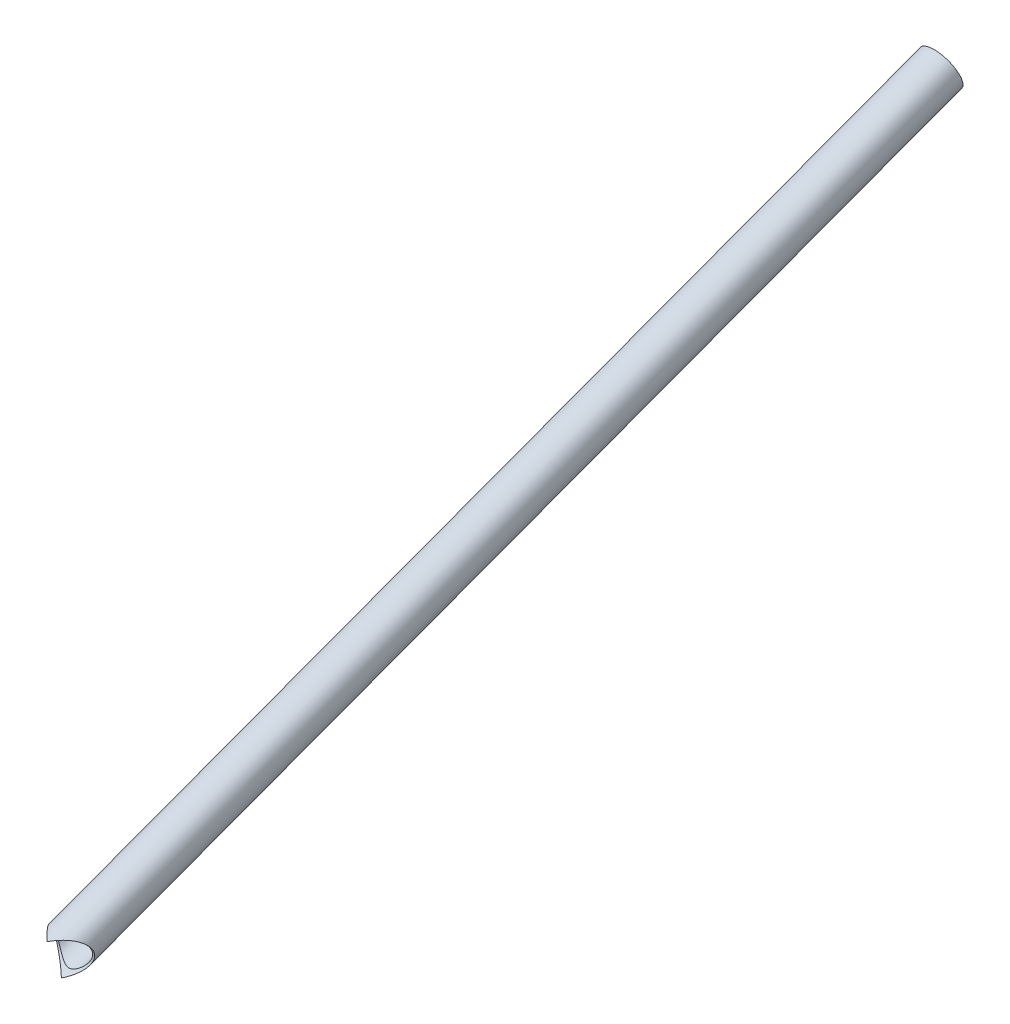
ISO-10303-21;
HEADER;
FILE_DESCRIPTION(('STEP AP214'),'2;1');
FILE_NAME('part.step','',(''),(''),'','','');
FILE_SCHEMA(('AUTOMOTIVE_DESIGN { 1 0 10303 214 1 1 1 1 }'));
ENDSEC;
DATA;
#1=APPLICATION_CONTEXT('core data for automotive mechanical design processes');
#2=APPLICATION_PROTOCOL_DEFINITION('international standard','automotive_design',2000,#1);
#3=PRODUCT_CONTEXT('',#1,'mechanical');
#4=PRODUCT('Part','Part','',(#3));
#5=PRODUCT_RELATED_PRODUCT_CATEGORY('part','',(#4));
#6=PRODUCT_DEFINITION_FORMATION('','',#4);
#7=PRODUCT_DEFINITION_CONTEXT('part definition',#1,'design');
#8=PRODUCT_DEFINITION('design','',#6,#7);
#9=PRODUCT_DEFINITION_SHAPE('','',#8);
#10=(LENGTH_UNIT() NAMED_UNIT(*) SI_UNIT(.MILLI.,.METRE.));
#11=(NAMED_UNIT(*) PLANE_ANGLE_UNIT() SI_UNIT($,.RADIAN.));
#12=(NAMED_UNIT(*) SI_UNIT($,.STERADIAN.) SOLID_ANGLE_UNIT());
#13=UNCERTAINTY_MEASURE_WITH_UNIT(LENGTH_MEASURE(1.E-05),#10,'distance_accuracy_value','');
#14=(GEOMETRIC_REPRESENTATION_CONTEXT(3) GLOBAL_UNCERTAINTY_ASSIGNED_CONTEXT((#13)) GLOBAL_UNIT_ASSIGNED_CONTEXT((#10,
#11,#12)) REPRESENTATION_CONTEXT('',''));
#15=CARTESIAN_POINT('',(0.,0.,0.));
#16=DIRECTION('',(0.,0.,1.));
#17=DIRECTION('',(1.,0.,0.));
#18=AXIS2_PLACEMENT_3D('',#15,#16,#17);
#19=CARTESIAN_POINT('',(0.,380.,-601.037933611912));
#20=DIRECTION('',(0.,0.347902326560255,-0.937530784120693));
#21=DIRECTION('',(0.,0.937530784120693,0.347902326560255));
#22=AXIS2_PLACEMENT_3D('',#19,#20,#21);
#23=CYLINDRICAL_SURFACE('',#22,11.3);
#24=CARTESIAN_POINT('',(0.,580.,-1140.));
#25=DIRECTION('',(0.,-0.347902326560255,0.937530784120693));
#26=DIRECTION('',(1.,0.,0.));
#27=AXIS2_PLACEMENT_3D('',#24,#25,#26);
#28=CIRCLE('',#27,11.3);
#29=CARTESIAN_POINT('',(11.3,580.,-1140.));
#30=VERTEX_POINT('',#29);
#31=EDGE_CURVE('E80',#30,#30,#28,.T.);
#32=ORIENTED_EDGE('',*,*,#31,.F.);
#33=EDGE_LOOP('',(#32));
#34=FACE_BOUND('',#33,.T.);
#35=CARTESIAN_POINT('',(0.,392.453342057347,-602.116947792873));
#36=CARTESIAN_POINT('',(-0.167247256523669,392.453342441627,-602.116952430379));
#37=CARTESIAN_POINT('',(-0.334517045693208,392.452597389198,-602.125650423935));
#38=CARTESIAN_POINT('',(-0.667369726955175,392.449556950798,-602.159902118997));
#39=CARTESIAN_POINT('',(-0.832951503456848,392.447260599479,-602.185466315847));
#40=CARTESIAN_POINT('',(-1.1614240790713,392.440941017438,-602.252057150859));
#41=CARTESIAN_POINT('',(-1.32430515357925,392.436912551836,-602.293130615677));
#42=CARTESIAN_POINT('',(-1.64603700319463,392.426892583405,-602.388728590837));
#43=CARTESIAN_POINT('',(-1.80488562586285,392.420900054992,-602.443260124969));
#44=CARTESIAN_POINT('',(-2.19446472620365,392.403220829904,-602.592990348526));
#45=CARTESIAN_POINT('',(-2.42248985758328,392.39018238157,-602.695055061053));
#46=CARTESIAN_POINT('',(-2.86869490176922,392.358315954157,-602.918018719347));
#47=CARTESIAN_POINT('',(-3.08686783951836,392.33948394488,-603.03893074697));
#48=CARTESIAN_POINT('',(-3.51477110345759,392.295191739672,-603.295193643021));
#49=CARTESIAN_POINT('',(-3.72447125377136,392.269709915723,-603.430590759169));
#50=CARTESIAN_POINT('',(-4.13549566719057,392.211485227177,-603.71194049216));
#51=CARTESIAN_POINT('',(-4.3368211139367,392.178743392844,-603.857891609311));
#52=CARTESIAN_POINT('',(-4.87692251430436,392.078475943431,-604.267764639645));
#53=CARTESIAN_POINT('',(-5.20819819231981,392.003052483123,-604.539691568161));
#54=CARTESIAN_POINT('',(-5.85078021100629,391.825781594503,-605.098362301212));
#55=CARTESIAN_POINT('',(-6.16207348921072,391.72391709677,-605.385115581008));
#56=CARTESIAN_POINT('',(-6.76486465930636,391.491440583005,-605.966912911055));
#57=CARTESIAN_POINT('',(-7.05638581661156,391.360863148603,-606.26194661868));
#58=CARTESIAN_POINT('',(-7.61920050725674,391.068571307631,-606.855680880781));
#59=CARTESIAN_POINT('',(-7.89050422320894,390.906872724431,-607.1543794999));
#60=CARTESIAN_POINT('',(-8.34731535676116,390.593761937343,-607.678051656785));
#61=CARTESIAN_POINT('',(-8.53757257777572,390.449513983037,-607.903181140762));
#62=CARTESIAN_POINT('',(-8.90424841032178,390.141071324446,-608.351113241831));
#63=CARTESIAN_POINT('',(-9.0806672368974,389.976876930223,-608.573915895036));
#64=CARTESIAN_POINT('',(-9.41781791022503,389.628060235374,-609.014734408191));
#65=CARTESIAN_POINT('',(-9.57857127359037,389.443466719029,-609.232756505723));
#66=CARTESIAN_POINT('',(-9.88273763612191,389.053202598082,-609.661946117587));
#67=CARTESIAN_POINT('',(-10.0261543955268,388.847536581964,-609.873115111036));
#68=CARTESIAN_POINT('',(-10.2671190114125,388.457726956456,-610.245238619388));
#69=CARTESIAN_POINT('',(-10.3681353034134,388.277335609576,-610.407884314735));
#70=CARTESIAN_POINT('',(-10.5563964070072,387.903175405704,-610.725555243905));
#71=CARTESIAN_POINT('',(-10.6436441819675,387.709409440241,-610.880582112552));
#72=CARTESIAN_POINT('',(-10.8031526496522,387.309059816766,-611.181419834839));
#73=CARTESIAN_POINT('',(-10.8754182916593,387.102480421007,-611.327233720845));
#74=CARTESIAN_POINT('',(-11.0038556543809,386.677312093936,-611.608099417645));
#75=CARTESIAN_POINT('',(-11.0600272004119,386.458723032304,-611.743151111617));
#76=CARTESIAN_POINT('',(-11.1555760567688,386.009389634075,-612.001730141394));
#77=CARTESIAN_POINT('',(-11.1948464280512,385.778577983701,-612.125180339967));
#78=CARTESIAN_POINT('',(-11.2553134552739,385.307718001965,-612.358141922711));
#79=CARTESIAN_POINT('',(-11.2765100657316,385.067669647361,-612.467653271805));
#80=CARTESIAN_POINT('',(-11.3003889325305,384.580389271138,-612.671495572959));
#81=CARTESIAN_POINT('',(-11.3030762859756,384.333159246052,-612.765830697279));
#82=CARTESIAN_POINT('',(-11.2898915969375,383.833664202421,-612.938472673762));
#83=CARTESIAN_POINT('',(-11.2740208675926,383.581399541359,-613.016780659517));
#84=CARTESIAN_POINT('',(-11.2265476182198,383.099392133039,-613.149908504596));
#85=CARTESIAN_POINT('',(-11.1966680163529,382.869906643212,-613.206290365006));
#86=CARTESIAN_POINT('',(-11.1226096819991,382.410260806115,-613.30561237424));
#87=CARTESIAN_POINT('',(-11.0784262356464,382.180100261192,-613.348548082663));
#88=CARTESIAN_POINT('',(-10.9764379778501,381.720751534017,-613.421110977959));
#89=CARTESIAN_POINT('',(-10.9186349086599,381.491563231209,-613.450739865663));
#90=CARTESIAN_POINT('',(-10.7901995529481,381.035480600346,-613.497080427393));
#91=CARTESIAN_POINT('',(-10.7195656521075,380.808586564742,-613.513790474635));
#92=CARTESIAN_POINT('',(-10.5623040366913,380.346434627591,-613.535383806888));
#93=CARTESIAN_POINT('',(-10.4750299432342,380.111365511493,-613.539597928109));
#94=CARTESIAN_POINT('',(-10.2883086228122,379.646310341169,-613.535094848314));
#95=CARTESIAN_POINT('',(-10.1888612488371,379.416324348367,-613.526377491118));
#96=CARTESIAN_POINT('',(-9.87373031565818,378.735286212779,-613.48209687685));
#97=CARTESIAN_POINT('',(-9.6412011545506,378.292989745149,-613.42841155254));
#98=CARTESIAN_POINT('',(-9.19848605201082,377.539062661362,-613.297781004797));
#99=CARTESIAN_POINT('',(-8.99600308024673,377.22125142674,-613.229329083034));
#100=CARTESIAN_POINT('',(-8.5719161587861,376.60391451748,-613.071967432378));
#101=CARTESIAN_POINT('',(-8.35031015416288,376.304390813907,-612.983055503174));
#102=CARTESIAN_POINT('',(-7.88922724120237,375.723699486472,-612.787719554018));
#103=CARTESIAN_POINT('',(-7.64968845980409,375.44260234321,-612.681233217905));
#104=CARTESIAN_POINT('',(-7.1548485146099,374.900804217675,-612.454343526597));
#105=CARTESIAN_POINT('',(-6.89955076540495,374.640098844555,-612.333943181338));
#106=CARTESIAN_POINT('',(-6.3673538008942,374.133815903112,-612.079673571762));
#107=CARTESIAN_POINT('',(-6.09007999538986,373.888761172595,-611.945547755311));
#108=CARTESIAN_POINT('',(-5.51917817242472,373.42217213273,-611.670690552847));
#109=CARTESIAN_POINT('',(-5.22554050591782,373.200651929237,-611.529955277387));
#110=CARTESIAN_POINT('',(-4.621679248474,372.784265487489,-611.248024459058));
#111=CARTESIAN_POINT('',(-4.3115180394719,372.589307686313,-611.106832308239));
#112=CARTESIAN_POINT('',(-3.83147780727146,372.319478088897,-610.900615135355));
#113=CARTESIAN_POINT('',(-3.66907620410565,372.233337223072,-610.832834528273));
#114=CARTESIAN_POINT('',(-3.33886130303319,372.069364809118,-610.700546322484));
#115=CARTESIAN_POINT('',(-3.17104958934559,371.991530856776,-610.636037779617));
#116=CARTESIAN_POINT('',(-2.85592807372785,371.856504980963,-610.521607880396));
#117=CARTESIAN_POINT('',(-2.70945473997353,371.797981595928,-610.470972350023));
#118=CARTESIAN_POINT('',(-2.41221080368844,371.688443488657,-610.374600346321));
#119=CARTESIAN_POINT('',(-2.26144032993178,371.637428541694,-610.32886372638));
#120=CARTESIAN_POINT('',(-1.80303053207386,371.497321774175,-610.201470122546));
#121=CARTESIAN_POINT('',(-1.48838666465815,371.420766829981,-610.129280950874));
#122=CARTESIAN_POINT('',(-1.02994230769028,371.342083552138,-610.054115343319));
#123=CARTESIAN_POINT('',(-0.891577853868114,371.32244556345,-610.035183417919));
#124=CARTESIAN_POINT('',(-0.613092024492928,371.29152552686,-610.00526002626));
#125=CARTESIAN_POINT('',(-0.472971578621382,371.280239232801,-609.994264525045));
#126=CARTESIAN_POINT('',(-0.191947405409433,371.266414211031,-609.980784076392));
#127=CARTESIAN_POINT('',(-0.0510440294322969,371.263871833961,-609.978295578475));
#128=CARTESIAN_POINT('',(0.230536171264379,371.267613396428,-609.98195007398));
#129=CARTESIAN_POINT('',(0.37121298810752,371.273897636466,-609.98809336127));
#130=CARTESIAN_POINT('',(0.650770198517014,371.295029545562,-610.008647179639));
#131=CARTESIAN_POINT('',(0.789655339860527,371.309845135506,-610.023026740065));
#132=CARTESIAN_POINT('',(1.06535436538545,371.347529490727,-610.05932112728));
#133=CARTESIAN_POINT('',(1.20216734949686,371.370401656458,-610.081239135743));
#134=CARTESIAN_POINT('',(1.60883972076339,371.45021706687,-610.156957476377));
#135=CARTESIAN_POINT('',(1.87470746913738,371.518340507326,-610.220702960518));
#136=CARTESIAN_POINT('',(2.37489852856182,371.673024068535,-610.361105057329));
#137=CARTESIAN_POINT('',(2.6101198375835,371.757925413914,-610.436518668541));
#138=CARTESIAN_POINT('',(3.0701702343698,371.945039223702,-610.597371617636));
#139=CARTESIAN_POINT('',(3.29498994421838,372.047266936507,-610.682819766082));
#140=CARTESIAN_POINT('',(3.73583456013439,372.26681716697,-610.859738055731));
#141=CARTESIAN_POINT('',(3.95182061427099,372.384198530073,-610.951230955821));
#142=CARTESIAN_POINT('',(4.37498141155462,372.631916056795,-611.136712070262));
#143=CARTESIAN_POINT('',(4.58215790526032,372.762249629325,-611.230699782779));
#144=CARTESIAN_POINT('',(5.12498523902664,373.126106470521,-611.481874845541));
#145=CARTESIAN_POINT('',(5.45355996844679,373.370187046896,-611.639150749578));
#146=CARTESIAN_POINT('',(6.0907682864414,373.887841280775,-611.945834499136));
#147=CARTESIAN_POINT('',(6.39938966229744,374.161432732539,-612.095237515796));
#148=CARTESIAN_POINT('',(6.99636022916789,374.735701123718,-612.3798788822));
#149=CARTESIAN_POINT('',(7.28474106953569,375.036334020264,-612.515139515726));
#150=CARTESIAN_POINT('',(7.84057125870951,375.663650466025,-612.766539727347));
#151=CARTESIAN_POINT('',(8.10803162666014,375.990320115687,-612.88268940755));
#152=CARTESIAN_POINT('',(8.55093243721588,376.57723878334,-613.062989324813));
#153=CARTESIAN_POINT('',(8.7317726970127,376.831717139535,-613.132722736806));
#154=CARTESIAN_POINT('',(9.07978253764383,377.353299250243,-613.257460550337));
#155=CARTESIAN_POINT('',(9.24695530987228,377.620400034267,-613.312468397195));
#156=CARTESIAN_POINT('',(9.56588969966902,378.166067433569,-613.405763642053));
#157=CARTESIAN_POINT('',(9.71766940528557,378.444620037947,-613.444070843478));
#158=CARTESIAN_POINT('',(10.0041765885252,379.01225061031,-613.502109870907));
#159=CARTESIAN_POINT('',(10.1389074068349,379.301326501944,-613.521845340889));
#160=CARTESIAN_POINT('',(10.3659931437835,379.833743992926,-613.539114756362));
#161=CARTESIAN_POINT('',(10.4615703100336,380.07560312263,-613.540092571396));
#162=CARTESIAN_POINT('',(10.6388867699247,380.563957164864,-613.527592566518));
#163=CARTESIAN_POINT('',(10.7206290893942,380.810451050587,-613.514117912258));
#164=CARTESIAN_POINT('',(10.8691128866135,381.306570405169,-613.471952445436));
#165=CARTESIAN_POINT('',(10.9358593956667,381.556194793934,-613.443266747278));
#166=CARTESIAN_POINT('',(11.0533164204513,382.056931908409,-613.370128959255));
#167=CARTESIAN_POINT('',(11.1040267716979,382.308044649358,-613.325676707679));
#168=CARTESIAN_POINT('',(11.1887460317201,382.811212485983,-613.220442014158));
#169=CARTESIAN_POINT('',(11.222658747834,383.063264866662,-613.159568532612));
#170=CARTESIAN_POINT('',(11.2726913157075,383.564723377991,-613.021687545756));
#171=CARTESIAN_POINT('',(11.288811121826,383.814129501851,-612.94467999906));
#172=CARTESIAN_POINT('',(11.3029289316654,384.308030067659,-612.775013563473));
#173=CARTESIAN_POINT('',(11.3009305574204,384.552525481521,-612.682357806474));
#174=CARTESIAN_POINT('',(11.2788604038768,385.034517432866,-612.48222112153));
#175=CARTESIAN_POINT('',(11.2587896909544,385.272014382448,-612.374741068623));
#176=CARTESIAN_POINT('',(11.2036134449015,385.716913769636,-612.15650430964));
#177=CARTESIAN_POINT('',(11.1700384991853,385.925090747014,-612.046931196924));
#178=CARTESIAN_POINT('',(11.0888111120566,386.332929071321,-611.817486922686));
#179=CARTESIAN_POINT('',(11.0411540084096,386.532587572914,-611.69761235996));
#180=CARTESIAN_POINT('',(10.9324744690753,386.922308515651,-611.448750141683));
#181=CARTESIAN_POINT('',(10.8714532920037,387.112371858386,-611.319763345088));
#182=CARTESIAN_POINT('',(10.7368564539712,387.482218827119,-611.053835838919));
#183=CARTESIAN_POINT('',(10.6632791655356,387.662001116487,-610.916894099776));
#184=CARTESIAN_POINT('',(10.4993528212438,388.021972467539,-610.627233875325));
#185=CARTESIAN_POINT('',(10.4082309025371,388.201448579849,-610.474066794308));
#186=CARTESIAN_POINT('',(10.2138664888675,388.547848055602,-610.161462662978));
#187=CARTESIAN_POINT('',(10.1106237567561,388.714771173336,-610.002025490029));
#188=CARTESIAN_POINT('',(9.78422982175343,389.196597606746,-609.516163310509));
#189=CARTESIAN_POINT('',(9.54433764296703,389.492719565535,-609.182055634283));
#190=CARTESIAN_POINT('',(9.08771890005952,389.972477729891,-608.581898369086));
#191=CARTESIAN_POINT('',(8.87851074008693,390.166277558371,-608.318023445481));
#192=CARTESIAN_POINT('',(8.4408722157184,390.526138380225,-607.787238726187));
#193=CARTESIAN_POINT('',(8.21243972933998,390.692196305391,-607.520328598289));
#194=CARTESIAN_POINT('',(7.73738014119386,390.998630123427,-606.985665367525));
#195=CARTESIAN_POINT('',(7.49067968458552,391.138893611826,-606.717913516594));
#196=CARTESIAN_POINT('',(6.98125802174676,391.394502402986,-606.185975875243));
#197=CARTESIAN_POINT('',(6.71854085780597,391.509853959899,-605.921789205432));
#198=CARTESIAN_POINT('',(6.17073490575872,391.719982122712,-605.393924420195));
#199=CARTESIAN_POINT('',(5.8852518796741,391.814174689694,-605.13042287183));
#200=CARTESIAN_POINT('',(5.29713781376664,391.980216146914,-604.615318196083));
#201=CARTESIAN_POINT('',(4.99449373827137,392.052047775376,-604.363724387426));
#202=CARTESIAN_POINT('',(4.37176112974694,392.175086145568,-603.880285622026));
#203=CARTESIAN_POINT('',(4.05175588404198,392.2263829144,-603.648358055298));
#204=CARTESIAN_POINT('',(3.55586462636953,392.289943004329,-603.322587931396));
#205=CARTESIAN_POINT('',(3.38802730762487,392.308891386102,-603.217741871994));
#206=CARTESIAN_POINT('',(3.04653636599128,392.342702729465,-603.017320899935));
#207=CARTESIAN_POINT('',(2.87288510116541,392.357567325399,-602.921742288359));
#208=CARTESIAN_POINT('',(2.54719479941652,392.381551552019,-602.756373542376));
#209=CARTESIAN_POINT('',(2.39605711451367,392.391207203993,-602.684892362241));
#210=CARTESIAN_POINT('',(2.08924059084774,392.40814968728,-602.551971190241));
#211=CARTESIAN_POINT('',(1.93356137694839,392.415436322302,-602.490532030644));
#212=CARTESIAN_POINT('',(1.6184626902933,392.427876162902,-602.379941561444));
#213=CARTESIAN_POINT('',(1.45906041031347,392.433037677564,-602.330742697737));
#214=CARTESIAN_POINT('',(1.13657534477607,392.44151668337,-602.246433253461));
#215=CARTESIAN_POINT('',(0.973495095455621,392.4448354071,-602.211313260355));
#216=CARTESIAN_POINT('',(0.675466385549127,392.449372201457,-602.162042771496));
#217=CARTESIAN_POINT('',(0.540967202588997,392.450867228905,-602.145197385068));
#218=CARTESIAN_POINT('',(0.270983789239345,392.452852144153,-602.122646432643));
#219=CARTESIAN_POINT('',(0.135499289620508,392.453341746014,-602.116944035688));
#220=CARTESIAN_POINT('',(0.,392.453342057347,-602.116947792873));
#221=B_SPLINE_CURVE_WITH_KNOTS('',3,(#35,#36,#37,#38,#39,#40,#41,#42,#43,#44,#45,#46,#47,#48,
#49,#50,#51,#52,#53,#54,#55,#56,#57,#58,#59,#60,#61,#62,#63,#64,#65,#66,#67,#68,#69,#70,#71,#72,
#73,#74,#75,#76,#77,#78,#79,#80,#81,#82,#83,#84,#85,#86,#87,#88,#89,#90,#91,#92,#93,#94,#95,#96,
#97,#98,#99,#100,#101,#102,#103,#104,#105,#106,#107,#108,#109,#110,#111,#112,#113,#114,#115,
#116,#117,#118,#119,#120,#121,#122,#123,#124,#125,#126,#127,#128,#129,#130,#131,#132,#133,#134,
#135,#136,#137,#138,#139,#140,#141,#142,#143,#144,#145,#146,#147,#148,#149,#150,#151,#152,#153,
#154,#155,#156,#157,#158,#159,#160,#161,#162,#163,#164,#165,#166,#167,#168,#169,#170,#171,#172,
#173,#174,#175,#176,#177,#178,#179,#180,#181,#182,#183,#184,#185,#186,#187,#188,#189,#190,#191,
#192,#193,#194,#195,#196,#197,#198,#199,#200,#201,#202,#203,#204,#205,#206,#207,#208,#209,#210,
#211,#212,#213,#214,#215,#216,#217,#218,#219,#220),.UNSPECIFIED.,.T.,.F.,(4,2,2,2,2,2,2,2,2,2,2,
2,2,2,2,2,2,2,2,2,2,2,2,2,2,2,2,2,2,2,2,2,2,2,2,2,2,2,2,2,2,2,2,2,2,2,2,2,2,2,2,2,2,2,2,2,2,2,2,
2,2,2,2,2,2,2,2,2,2,2,2,2,2,2,2,2,2,2,2,2,2,2,2,2,2,2,2,2,2,2,2,2,4),(0.,0.50156189031862,
1.00343618267204,1.50683804462668,2.01050319053983,2.7596831409342,3.50938542921268,
4.26155713380823,5.01362216631335,6.31733953430028,7.6219006394543,8.92489906458463,
10.2272367294797,11.2109089332464,12.1945658480389,13.1768520767654,14.1589248678792,
14.9473564069977,15.7356180216202,16.5236188210439,17.3116281730112,18.1045527137268,
18.8974792498243,19.6901874200189,20.4828395029281,21.1966025290207,21.9106010172659,
22.6245082187222,23.3385053031425,24.0901029594631,24.8417096933185,26.3444063412981,
27.4920366903508,28.6397905156318,29.7917051656322,30.9433710935166,32.1230758513897,
33.3034837447988,34.4797137523858,35.0672876855157,35.6546910973887,36.1513724300808,
36.6480388941429,37.6382403306924,38.0609385019661,38.4834216177156,38.9057283845959,
39.3280495291707,39.7487929589884,40.1697141859677,41.0122294577139,41.7947356042898,
42.577934020411,43.3642708187059,44.15045062579,45.4641730915501,46.7786921719247,
48.0911077539953,49.4028273447409,50.3616983346249,51.320344782321,52.2778513661226,
53.2351700374323,54.0146107168806,54.7938807034397,55.5728888423085,56.3519049712989,
57.1353320433633,57.9187611250192,58.7020335935784,59.4852598474019,60.1973712565017,
60.9097186917361,61.6219990675929,62.3343718366999,63.0924181515616,63.850479300367,
65.3659421428041,66.5301466996558,67.6944799304573,68.8637725959993,70.0327713679088,
71.2308872484099,72.4299257473181,73.6236483940304,74.2197843289861,74.8156813399855,
75.3177670679917,75.8198943870299,76.3200393369045,76.8198493511486,77.2260859705474,
77.6324381060115),.UNSPECIFIED.);
#222=CARTESIAN_POINT('',(0.,392.453342057347,-602.116947792873));
#223=VERTEX_POINT('',#222);
#224=EDGE_CURVE('E83',#223,#223,#221,.T.);
#225=ORIENTED_EDGE('',*,*,#224,.T.);
#226=EDGE_LOOP('',(#225));
#227=FACE_BOUND('',#226,.T.);
#228=ADVANCED_FACE('F41',(#34,#227),#23,.F.);
#229=CARTESIAN_POINT('',(0.,580.,-1140.));
#230=DIRECTION('',(0.,-0.347902326560255,0.937530784120693));
#231=DIRECTION('',(1.,0.,0.));
#232=AXIS2_PLACEMENT_3D('',#229,#230,#231);
#233=PLANE('',#232);
#234=ORIENTED_EDGE('',*,*,#31,.T.);
#235=EDGE_LOOP('',(#234));
#236=FACE_BOUND('',#235,.T.);
#237=CARTESIAN_POINT('',(0.,580.,-1140.));
#238=DIRECTION('',(0.,-0.347902326560255,0.937530784120693));
#239=DIRECTION('',(1.,0.,0.));
#240=AXIS2_PLACEMENT_3D('',#237,#238,#239);
#241=CIRCLE('',#240,12.5);
#242=CARTESIAN_POINT('',(12.5,580.,-1140.));
#243=VERTEX_POINT('',#242);
#244=EDGE_CURVE('E57',#243,#243,#241,.T.);
#245=ORIENTED_EDGE('',*,*,#244,.F.);
#246=EDGE_LOOP('',(#245));
#247=FACE_BOUND('',#246,.T.);
#248=ADVANCED_FACE('F60',(#236,#247),#233,.F.);
#249=CARTESIAN_POINT('',(0.,380.,-601.037933611912));
#250=DIRECTION('',(0.,0.347902326560255,-0.937530784120693));
#251=DIRECTION('',(0.,0.937530784120693,0.347902326560255));
#252=AXIS2_PLACEMENT_3D('',#249,#250,#251);
#253=CYLINDRICAL_SURFACE('',#252,12.5);
#254=ORIENTED_EDGE('',*,*,#244,.T.);
#255=EDGE_LOOP('',(#254));
#256=FACE_BOUND('',#255,.T.);
#257=CARTESIAN_POINT('',(0.,380.,-601.037933611912));
#258=DIRECTION('',(-0.707106781186547,0.246004094301333,-0.662934375022883));
#259=DIRECTION('',(0.707106781186547,0.246004094301333,-0.662934375022883));
#260=AXIS2_PLACEMENT_3D('',#257,#258,#259);
#261=ELLIPSE('',#260,17.6776695296637,12.5);
#262=CARTESIAN_POINT('',(0.,368.280865198491,-605.386712693915));
#263=VERTEX_POINT('',#262);
#264=CARTESIAN_POINT('',(0.,391.719134801509,-596.689154529909));
#265=VERTEX_POINT('',#264);
#266=EDGE_CURVE('E11',#263,#265,#261,.F.);
#267=ORIENTED_EDGE('',*,*,#266,.F.);
#268=CARTESIAN_POINT('',(0.,380.,-601.037933611912));
#269=DIRECTION('',(0.707106781186547,0.246004094301333,-0.662934375022883));
#270=DIRECTION('',(-0.707106781186547,0.246004094301333,-0.662934375022883));
#271=AXIS2_PLACEMENT_3D('',#268,#269,#270);
#272=ELLIPSE('',#271,17.6776695296637,12.5);
#273=EDGE_CURVE('E49',#265,#263,#272,.F.);
#274=ORIENTED_EDGE('',*,*,#273,.F.);
#275=EDGE_LOOP('',(#267,#274));
#276=FACE_BOUND('',#275,.T.);
#277=ADVANCED_FACE('F58',(#256,#276),#253,.T.);
#278=CARTESIAN_POINT('',(80.,380.,-601.037933611912));
#279=DIRECTION('',(-1.,0.,0.));
#280=DIRECTION('',(0.,0.,1.));
#281=AXIS2_PLACEMENT_3D('',#278,#279,#280);
#282=CYLINDRICAL_SURFACE('',#281,12.5);
#283=ORIENTED_EDGE('',*,*,#224,.F.);
#284=EDGE_LOOP('',(#283));
#285=FACE_BOUND('',#284,.T.);
#286=ORIENTED_EDGE('',*,*,#266,.T.);
#287=ORIENTED_EDGE('',*,*,#273,.T.);
#288=EDGE_LOOP('',(#286,#287));
#289=FACE_BOUND('',#288,.T.);
#290=ADVANCED_FACE('F55',(#285,#289),#282,.F.);
#291=CLOSED_SHELL('',(#228,#248,#277,#290));
#292=MANIFOLD_SOLID_BREP('B2',#291);
#293=ADVANCED_BREP_SHAPE_REPRESENTATION('',(#18,#292),#14);
#294=SHAPE_DEFINITION_REPRESENTATION(#9,#293);
ENDSEC;
END-ISO-10303-21;
